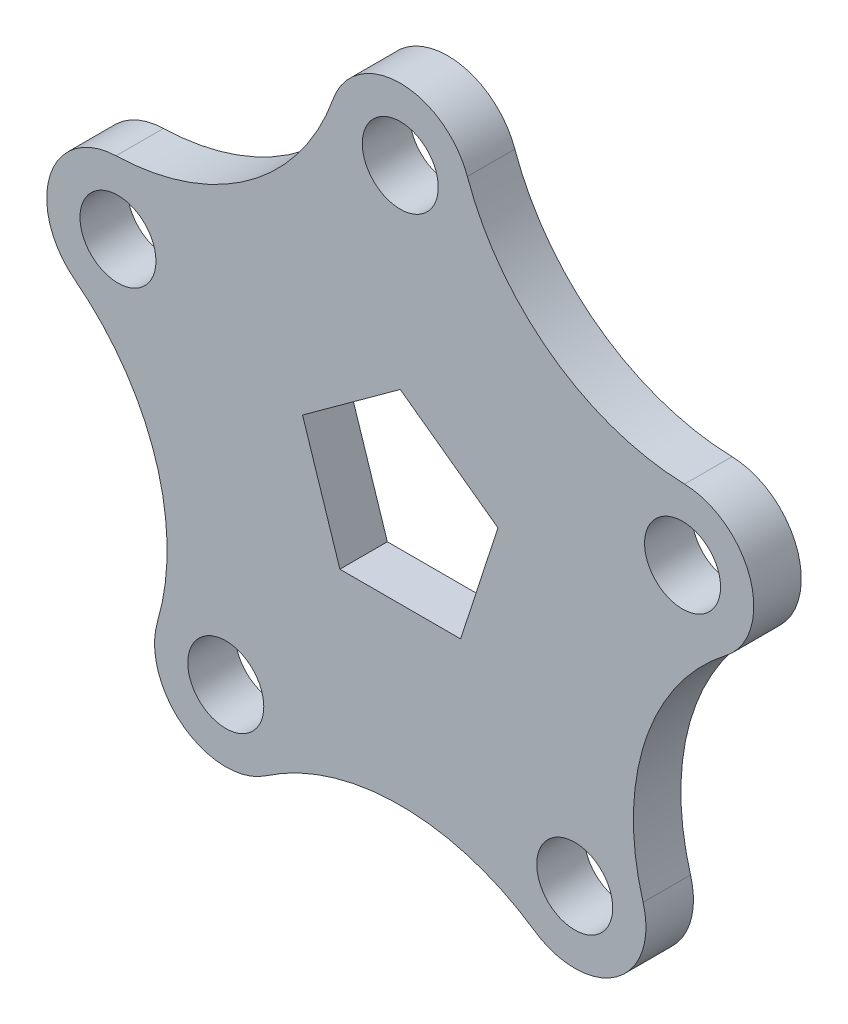
ISO-10303-21;
HEADER;
FILE_DESCRIPTION(('STEP AP214'),'2;1');
FILE_NAME('part.step','',(''),(''),'','','');
FILE_SCHEMA(('AUTOMOTIVE_DESIGN { 1 0 10303 214 1 1 1 1 }'));
ENDSEC;
DATA;
#1=APPLICATION_CONTEXT('core data for automotive mechanical design processes');
#2=APPLICATION_PROTOCOL_DEFINITION('international standard','automotive_design',2000,#1);
#3=PRODUCT_CONTEXT('',#1,'mechanical');
#4=PRODUCT('Part','Part','',(#3));
#5=PRODUCT_RELATED_PRODUCT_CATEGORY('part','',(#4));
#6=PRODUCT_DEFINITION_FORMATION('','',#4);
#7=PRODUCT_DEFINITION_CONTEXT('part definition',#1,'design');
#8=PRODUCT_DEFINITION('design','',#6,#7);
#9=PRODUCT_DEFINITION_SHAPE('','',#8);
#10=(LENGTH_UNIT() NAMED_UNIT(*) SI_UNIT(.MILLI.,.METRE.));
#11=(NAMED_UNIT(*) PLANE_ANGLE_UNIT() SI_UNIT($,.RADIAN.));
#12=(NAMED_UNIT(*) SI_UNIT($,.STERADIAN.) SOLID_ANGLE_UNIT());
#13=UNCERTAINTY_MEASURE_WITH_UNIT(LENGTH_MEASURE(1.E-05),#10,'distance_accuracy_value','');
#14=(GEOMETRIC_REPRESENTATION_CONTEXT(3) GLOBAL_UNCERTAINTY_ASSIGNED_CONTEXT((#13)) GLOBAL_UNIT_ASSIGNED_CONTEXT((#10,
#11,#12)) REPRESENTATION_CONTEXT('',''));
#15=CARTESIAN_POINT('',(0.,0.,0.));
#16=DIRECTION('',(0.,0.,1.));
#17=DIRECTION('',(1.,0.,0.));
#18=AXIS2_PLACEMENT_3D('',#15,#16,#17);
#19=CARTESIAN_POINT('',(60.3401721578418,51.8011220361711,10.));
#20=DIRECTION('',(0.,0.,1.));
#21=DIRECTION('',(1.,0.,0.));
#22=AXIS2_PLACEMENT_3D('',#19,#20,#21);
#23=PLANE('',#22);
#24=CARTESIAN_POINT('',(-36.7365782682793,-50.5635621484338,10.));
#25=DIRECTION('',(0.,0.,1.));
#26=DIRECTION('',(1.,0.,0.));
#27=AXIS2_PLACEMENT_3D('',#24,#25,#26);
#28=CIRCLE('',#27,8.00000000000067);
#29=CARTESIAN_POINT('',(-28.7365782682786,-50.5635621484338,10.));
#30=VERTEX_POINT('',#29);
#31=EDGE_CURVE('E514',#30,#30,#28,.T.);
#32=ORIENTED_EDGE('',*,*,#31,.F.);
#33=EDGE_LOOP('',(#32));
#34=FACE_BOUND('',#33,.T.);
#35=CARTESIAN_POINT('',(59.4410322684476,19.3135621484339,10.));
#36=DIRECTION('',(0.,0.,1.));
#37=DIRECTION('',(1.,0.,0.));
#38=AXIS2_PLACEMENT_3D('',#35,#36,#37);
#39=CIRCLE('',#38,7.99999999999969);
#40=CARTESIAN_POINT('',(67.4410322684473,19.3135621484339,10.));
#41=VERTEX_POINT('',#40);
#42=EDGE_CURVE('E525',#41,#41,#39,.T.);
#43=ORIENTED_EDGE('',*,*,#42,.F.);
#44=EDGE_LOOP('',(#43));
#45=FACE_BOUND('',#44,.T.);
#46=DIRECTION('',(-0.809016994374947,0.587785252292473,0.));
#47=VECTOR('',#46,1.);
#48=CARTESIAN_POINT('',(20.5724838302366,6.68440519687683,10.));
#49=LINE('',#48,#47);
#50=CARTESIAN_POINT('',(20.5724838302366,6.68440519687683,10.));
#51=VERTEX_POINT('',#50);
#52=CARTESIAN_POINT('',(0.,21.6311896062463,10.));
#53=VERTEX_POINT('',#52);
#54=EDGE_CURVE('E153',#51,#53,#49,.T.);
#55=ORIENTED_EDGE('',*,*,#54,.F.);
#56=DIRECTION('',(0.309016994374948,0.951056516295153,0.));
#57=VECTOR('',#56,1.);
#58=CARTESIAN_POINT('',(12.7144942400938,-17.5,10.));
#59=LINE('',#58,#57);
#60=CARTESIAN_POINT('',(12.7144942400938,-17.5,10.));
#61=VERTEX_POINT('',#60);
#62=EDGE_CURVE('E147',#61,#51,#59,.T.);
#63=ORIENTED_EDGE('',*,*,#62,.F.);
#64=DIRECTION('',(1.,0.,0.));
#65=VECTOR('',#64,1.);
#66=CARTESIAN_POINT('',(-12.7144942400938,-17.5,10.));
#67=LINE('',#66,#65);
#68=CARTESIAN_POINT('',(-12.7144942400938,-17.5,10.));
#69=VERTEX_POINT('',#68);
#70=EDGE_CURVE('E172',#69,#61,#67,.T.);
#71=ORIENTED_EDGE('',*,*,#70,.F.);
#72=DIRECTION('',(0.309016994374947,-0.951056516295154,0.));
#73=VECTOR('',#72,1.);
#74=CARTESIAN_POINT('',(-20.5724838302366,6.68440519687686,10.));
#75=LINE('',#74,#73);
#76=CARTESIAN_POINT('',(-20.5724838302366,6.68440519687686,10.));
#77=VERTEX_POINT('',#76);
#78=EDGE_CURVE('E169',#77,#69,#75,.T.);
#79=ORIENTED_EDGE('',*,*,#78,.F.);
#80=DIRECTION('',(-0.809016994374948,-0.587785252292473,0.));
#81=VECTOR('',#80,1.);
#82=CARTESIAN_POINT('',(0.,21.6311896062463,10.));
#83=LINE('',#82,#81);
#84=EDGE_CURVE('E166',#53,#77,#83,.T.);
#85=ORIENTED_EDGE('',*,*,#84,.F.);
#86=EDGE_LOOP('',(#55,#63,#71,#79,#85));
#87=FACE_BOUND('',#86,.T.);
#88=CARTESIAN_POINT('',(61.2393120472361,84.2886819239083,10.));
#89=DIRECTION('',(0.,0.,-1.));
#90=DIRECTION('',(1.,0.,0.));
#91=AXIS2_PLACEMENT_3D('',#88,#89,#90);
#92=CIRCLE('',#91,50.0000000000007);
#93=CARTESIAN_POINT('',(59.856019909707,34.3078205581582,10.));
#94=VERTEX_POINT('',#93);
#95=CARTESIAN_POINT('',(14.1321489339769,67.5281573670544,10.));
#96=VERTEX_POINT('',#95);
#97=EDGE_CURVE('E194',#94,#96,#92,.T.);
#98=ORIENTED_EDGE('',*,*,#97,.T.);
#99=CARTESIAN_POINT('',(0.,62.5,10.));
#100=DIRECTION('',(0.,0.,1.));
#101=DIRECTION('',(1.,0.,0.));
#102=AXIS2_PLACEMENT_3D('',#99,#100,#101);
#103=CIRCLE('',#102,14.9999999999989);
#104=CARTESIAN_POINT('',(-14.1321489339775,67.5281573670528,10.));
#105=VERTEX_POINT('',#104);
#106=EDGE_CURVE('E196',#96,#105,#103,.T.);
#107=ORIENTED_EDGE('',*,*,#106,.T.);
#108=CARTESIAN_POINT('',(-61.2393120472356,84.2886819239057,10.));
#109=DIRECTION('',(0.,0.,-1.));
#110=DIRECTION('',(1.,0.,0.));
#111=AXIS2_PLACEMENT_3D('',#108,#109,#110);
#112=CIRCLE('',#111,50.0000000000004);
#113=CARTESIAN_POINT('',(-59.8560199097055,34.307820558156,10.));
#114=VERTEX_POINT('',#113);
#115=EDGE_CURVE('E198',#105,#114,#112,.T.);
#116=ORIENTED_EDGE('',*,*,#115,.T.);
#117=CARTESIAN_POINT('',(-59.4410322684464,19.3135621484333,10.));
#118=DIRECTION('',(0.,0.,1.));
#119=DIRECTION('',(1.,0.,0.));
#120=AXIS2_PLACEMENT_3D('',#117,#118,#119);
#121=CIRCLE('',#120,14.999999999999);
#122=CARTESIAN_POINT('',(-68.5901682849784,7.42687589233284,10.));
#123=VERTEX_POINT('',#122);
#124=EDGE_CURVE('E202',#114,#123,#121,.T.);
#125=ORIENTED_EDGE('',*,*,#124,.T.);
#126=CARTESIAN_POINT('',(-99.0872883400892,-32.1954116280032,10.));
#127=DIRECTION('',(0.,0.,-1.));
#128=DIRECTION('',(1.,0.,0.));
#129=AXIS2_PLACEMENT_3D('',#126,#127,#128);
#130=CIRCLE('',#129,50.0000000000003);
#131=CARTESIAN_POINT('',(-51.1252036694668,-46.3247581821818,10.));
#132=VERTEX_POINT('',#131);
#133=EDGE_CURVE('E201',#123,#132,#130,.T.);
#134=ORIENTED_EDGE('',*,*,#133,.T.);
#135=CARTESIAN_POINT('',(-36.7365782682793,-50.5635621484338,10.));
#136=DIRECTION('',(0.,0.,1.));
#137=DIRECTION('',(1.,0.,0.));
#138=AXIS2_PLACEMENT_3D('',#135,#136,#137);
#139=CIRCLE('',#138,14.9999999999993);
#140=CARTESIAN_POINT('',(-28.2589063602162,-62.9380956353664,10.));
#141=VERTEX_POINT('',#140);
#142=EDGE_CURVE('E203',#132,#141,#139,.T.);
#143=ORIENTED_EDGE('',*,*,#142,.T.);
#144=CARTESIAN_POINT('',(-6.03683769639929E-13,-104.186540591808,10.));
#145=DIRECTION('',(0.,0.,-1.));
#146=DIRECTION('',(1.,0.,0.));
#147=AXIS2_PLACEMENT_3D('',#144,#145,#146);
#148=CIRCLE('',#147,50.0000000000019);
#149=CARTESIAN_POINT('',(28.2589063602154,-62.9380956353652,10.));
#150=VERTEX_POINT('',#149);
#151=EDGE_CURVE('E207',#141,#150,#148,.T.);
#152=ORIENTED_EDGE('',*,*,#151,.T.);
#153=CARTESIAN_POINT('',(36.7365782682834,-50.5635621484358,10.));
#154=DIRECTION('',(0.,0.,1.));
#155=DIRECTION('',(1.,0.,0.));
#156=AXIS2_PLACEMENT_3D('',#153,#154,#155);
#157=CIRCLE('',#156,14.9999999999972);
#158=CARTESIAN_POINT('',(51.1252036694668,-46.3247581821811,10.));
#159=VERTEX_POINT('',#158);
#160=EDGE_CURVE('E208',#150,#159,#157,.T.);
#161=ORIENTED_EDGE('',*,*,#160,.T.);
#162=CARTESIAN_POINT('',(99.0872883400888,-32.1954116280044,10.));
#163=DIRECTION('',(0.,0.,-1.));
#164=DIRECTION('',(1.,0.,0.));
#165=AXIS2_PLACEMENT_3D('',#162,#163,#164);
#166=CIRCLE('',#165,50.0000000000001);
#167=CARTESIAN_POINT('',(68.5901682849799,7.42687589233302,10.));
#168=VERTEX_POINT('',#167);
#169=EDGE_CURVE('E213',#159,#168,#166,.T.);
#170=ORIENTED_EDGE('',*,*,#169,.T.);
#171=CARTESIAN_POINT('',(59.4410322684476,19.3135621484339,10.));
#172=DIRECTION('',(0.,0.,1.));
#173=DIRECTION('',(1.,0.,0.));
#174=AXIS2_PLACEMENT_3D('',#171,#172,#173);
#175=CIRCLE('',#174,14.9999999999995);
#176=EDGE_CURVE('E211',#168,#94,#175,.T.);
#177=ORIENTED_EDGE('',*,*,#176,.T.);
#178=EDGE_LOOP('',(#98,#107,#116,#125,#134,#143,#152,#161,#170,#177));
#179=FACE_BOUND('',#178,.T.);
#180=CARTESIAN_POINT('',(0.,62.5,10.));
#181=DIRECTION('',(0.,0.,1.));
#182=DIRECTION('',(1.,0.,0.));
#183=AXIS2_PLACEMENT_3D('',#180,#181,#182);
#184=CIRCLE('',#183,8.);
#185=CARTESIAN_POINT('',(8.,62.5,10.));
#186=VERTEX_POINT('',#185);
#187=EDGE_CURVE('E178',#186,#186,#184,.T.);
#188=ORIENTED_EDGE('',*,*,#187,.F.);
#189=EDGE_LOOP('',(#188));
#190=FACE_BOUND('',#189,.T.);
#191=CARTESIAN_POINT('',(36.7365782682834,-50.5635621484358,10.));
#192=DIRECTION('',(0.,0.,1.));
#193=DIRECTION('',(1.,0.,0.));
#194=AXIS2_PLACEMENT_3D('',#191,#192,#193);
#195=CIRCLE('',#194,8.00000000000139);
#196=CARTESIAN_POINT('',(44.7365782682848,-50.5635621484358,10.));
#197=VERTEX_POINT('',#196);
#198=EDGE_CURVE('E519',#197,#197,#195,.T.);
#199=ORIENTED_EDGE('',*,*,#198,.F.);
#200=EDGE_LOOP('',(#199));
#201=FACE_BOUND('',#200,.T.);
#202=CARTESIAN_POINT('',(-59.4410322684464,19.3135621484333,10.));
#203=DIRECTION('',(0.,0.,1.));
#204=DIRECTION('',(1.,0.,0.));
#205=AXIS2_PLACEMENT_3D('',#202,#203,#204);
#206=CIRCLE('',#205,8.0000000000016);
#207=CARTESIAN_POINT('',(-51.4410322684448,19.3135621484333,10.));
#208=VERTEX_POINT('',#207);
#209=EDGE_CURVE('E503',#208,#208,#206,.T.);
#210=ORIENTED_EDGE('',*,*,#209,.F.);
#211=EDGE_LOOP('',(#210));
#212=FACE_BOUND('',#211,.T.);
#213=ADVANCED_FACE('F39',(#34,#45,#87,#179,#190,#201,#212),#23,.T.);
#214=CARTESIAN_POINT('',(60.3401721578418,51.8011220361711,0.));
#215=DIRECTION('',(0.,0.,1.));
#216=DIRECTION('',(1.,0.,0.));
#217=AXIS2_PLACEMENT_3D('',#214,#215,#216);
#218=PLANE('',#217);
#219=CARTESIAN_POINT('',(61.2393120472361,84.2886819239083,0.));
#220=DIRECTION('',(0.,0.,-1.));
#221=DIRECTION('',(1.,0.,0.));
#222=AXIS2_PLACEMENT_3D('',#219,#220,#221);
#223=CIRCLE('',#222,50.0000000000007);
#224=CARTESIAN_POINT('',(59.856019909707,34.3078205581582,0.));
#225=VERTEX_POINT('',#224);
#226=CARTESIAN_POINT('',(14.1321489339769,67.5281573670544,0.));
#227=VERTEX_POINT('',#226);
#228=EDGE_CURVE('E162',#225,#227,#223,.T.);
#229=ORIENTED_EDGE('',*,*,#228,.F.);
#230=CARTESIAN_POINT('',(59.4410322684476,19.3135621484339,0.));
#231=DIRECTION('',(0.,0.,1.));
#232=DIRECTION('',(1.,0.,0.));
#233=AXIS2_PLACEMENT_3D('',#230,#231,#232);
#234=CIRCLE('',#233,14.9999999999995);
#235=CARTESIAN_POINT('',(68.5901682849799,7.42687589233302,0.));
#236=VERTEX_POINT('',#235);
#237=EDGE_CURVE('E197',#236,#225,#234,.T.);
#238=ORIENTED_EDGE('',*,*,#237,.F.);
#239=CARTESIAN_POINT('',(99.0872883400888,-32.1954116280044,0.));
#240=DIRECTION('',(0.,0.,-1.));
#241=DIRECTION('',(1.,0.,0.));
#242=AXIS2_PLACEMENT_3D('',#239,#240,#241);
#243=CIRCLE('',#242,50.0000000000001);
#244=CARTESIAN_POINT('',(51.1252036694668,-46.3247581821811,0.));
#245=VERTEX_POINT('',#244);
#246=EDGE_CURVE('E235',#245,#236,#243,.T.);
#247=ORIENTED_EDGE('',*,*,#246,.F.);
#248=CARTESIAN_POINT('',(36.7365782682834,-50.5635621484358,0.));
#249=DIRECTION('',(0.,0.,1.));
#250=DIRECTION('',(1.,0.,0.));
#251=AXIS2_PLACEMENT_3D('',#248,#249,#250);
#252=CIRCLE('',#251,14.9999999999972);
#253=CARTESIAN_POINT('',(28.2589063602154,-62.9380956353652,0.));
#254=VERTEX_POINT('',#253);
#255=EDGE_CURVE('E229',#254,#245,#252,.T.);
#256=ORIENTED_EDGE('',*,*,#255,.F.);
#257=CARTESIAN_POINT('',(-6.03683769639929E-13,-104.186540591808,0.));
#258=DIRECTION('',(0.,0.,-1.));
#259=DIRECTION('',(1.,0.,0.));
#260=AXIS2_PLACEMENT_3D('',#257,#258,#259);
#261=CIRCLE('',#260,50.0000000000019);
#262=CARTESIAN_POINT('',(-28.2589063602162,-62.9380956353664,0.));
#263=VERTEX_POINT('',#262);
#264=EDGE_CURVE('E228',#263,#254,#261,.T.);
#265=ORIENTED_EDGE('',*,*,#264,.F.);
#266=CARTESIAN_POINT('',(-36.7365782682793,-50.5635621484338,0.));
#267=DIRECTION('',(0.,0.,1.));
#268=DIRECTION('',(1.,0.,0.));
#269=AXIS2_PLACEMENT_3D('',#266,#267,#268);
#270=CIRCLE('',#269,14.9999999999993);
#271=CARTESIAN_POINT('',(-51.1252036694668,-46.3247581821818,0.));
#272=VERTEX_POINT('',#271);
#273=EDGE_CURVE('E226',#272,#263,#270,.T.);
#274=ORIENTED_EDGE('',*,*,#273,.F.);
#275=CARTESIAN_POINT('',(-99.0872883400892,-32.1954116280032,0.));
#276=DIRECTION('',(0.,0.,-1.));
#277=DIRECTION('',(1.,0.,0.));
#278=AXIS2_PLACEMENT_3D('',#275,#276,#277);
#279=CIRCLE('',#278,50.0000000000003);
#280=CARTESIAN_POINT('',(-68.5901682849784,7.42687589233284,0.));
#281=VERTEX_POINT('',#280);
#282=EDGE_CURVE('E222',#281,#272,#279,.T.);
#283=ORIENTED_EDGE('',*,*,#282,.F.);
#284=CARTESIAN_POINT('',(-59.4410322684464,19.3135621484333,0.));
#285=DIRECTION('',(0.,0.,1.));
#286=DIRECTION('',(1.,0.,0.));
#287=AXIS2_PLACEMENT_3D('',#284,#285,#286);
#288=CIRCLE('',#287,14.999999999999);
#289=CARTESIAN_POINT('',(-59.8560199097055,34.307820558156,0.));
#290=VERTEX_POINT('',#289);
#291=EDGE_CURVE('E225',#290,#281,#288,.T.);
#292=ORIENTED_EDGE('',*,*,#291,.F.);
#293=CARTESIAN_POINT('',(-61.2393120472356,84.2886819239057,0.));
#294=DIRECTION('',(0.,0.,-1.));
#295=DIRECTION('',(1.,0.,0.));
#296=AXIS2_PLACEMENT_3D('',#293,#294,#295);
#297=CIRCLE('',#296,50.0000000000004);
#298=CARTESIAN_POINT('',(-14.1321489339775,67.5281573670528,0.));
#299=VERTEX_POINT('',#298);
#300=EDGE_CURVE('E217',#299,#290,#297,.T.);
#301=ORIENTED_EDGE('',*,*,#300,.F.);
#302=CARTESIAN_POINT('',(0.,62.5,0.));
#303=DIRECTION('',(0.,0.,1.));
#304=DIRECTION('',(1.,0.,0.));
#305=AXIS2_PLACEMENT_3D('',#302,#303,#304);
#306=CIRCLE('',#305,14.9999999999989);
#307=EDGE_CURVE('E216',#227,#299,#306,.T.);
#308=ORIENTED_EDGE('',*,*,#307,.F.);
#309=EDGE_LOOP('',(#229,#238,#247,#256,#265,#274,#283,#292,#301,#308));
#310=FACE_BOUND('',#309,.T.);
#311=DIRECTION('',(0.309016994374948,0.951056516295153,0.));
#312=VECTOR('',#311,1.);
#313=CARTESIAN_POINT('',(12.7144942400938,-17.5,0.));
#314=LINE('',#313,#312);
#315=CARTESIAN_POINT('',(12.7144942400938,-17.5,0.));
#316=VERTEX_POINT('',#315);
#317=CARTESIAN_POINT('',(20.5724838302366,6.68440519687683,0.));
#318=VERTEX_POINT('',#317);
#319=EDGE_CURVE('E62',#316,#318,#314,.T.);
#320=ORIENTED_EDGE('',*,*,#319,.T.);
#321=DIRECTION('',(-0.809016994374947,0.587785252292473,0.));
#322=VECTOR('',#321,1.);
#323=CARTESIAN_POINT('',(20.5724838302366,6.68440519687683,0.));
#324=LINE('',#323,#322);
#325=CARTESIAN_POINT('',(0.,21.6311896062463,0.));
#326=VERTEX_POINT('',#325);
#327=EDGE_CURVE('E161',#318,#326,#324,.T.);
#328=ORIENTED_EDGE('',*,*,#327,.T.);
#329=DIRECTION('',(-0.809016994374948,-0.587785252292473,0.));
#330=VECTOR('',#329,1.);
#331=CARTESIAN_POINT('',(0.,21.6311896062463,0.));
#332=LINE('',#331,#330);
#333=CARTESIAN_POINT('',(-20.5724838302366,6.68440519687686,0.));
#334=VERTEX_POINT('',#333);
#335=EDGE_CURVE('E179',#326,#334,#332,.T.);
#336=ORIENTED_EDGE('',*,*,#335,.T.);
#337=DIRECTION('',(0.309016994374947,-0.951056516295154,0.));
#338=VECTOR('',#337,1.);
#339=CARTESIAN_POINT('',(-20.5724838302366,6.68440519687686,0.));
#340=LINE('',#339,#338);
#341=CARTESIAN_POINT('',(-12.7144942400938,-17.5,0.));
#342=VERTEX_POINT('',#341);
#343=EDGE_CURVE('E183',#334,#342,#340,.T.);
#344=ORIENTED_EDGE('',*,*,#343,.T.);
#345=DIRECTION('',(1.,0.,0.));
#346=VECTOR('',#345,1.);
#347=CARTESIAN_POINT('',(-12.7144942400938,-17.5,0.));
#348=LINE('',#347,#346);
#349=EDGE_CURVE('E155',#342,#316,#348,.T.);
#350=ORIENTED_EDGE('',*,*,#349,.T.);
#351=EDGE_LOOP('',(#320,#328,#336,#344,#350));
#352=FACE_BOUND('',#351,.T.);
#353=CARTESIAN_POINT('',(0.,62.5,0.));
#354=DIRECTION('',(0.,0.,1.));
#355=DIRECTION('',(1.,0.,0.));
#356=AXIS2_PLACEMENT_3D('',#353,#354,#355);
#357=CIRCLE('',#356,8.);
#358=CARTESIAN_POINT('',(8.,62.5,0.));
#359=VERTEX_POINT('',#358);
#360=EDGE_CURVE('E526',#359,#359,#357,.T.);
#361=ORIENTED_EDGE('',*,*,#360,.T.);
#362=EDGE_LOOP('',(#361));
#363=FACE_BOUND('',#362,.T.);
#364=CARTESIAN_POINT('',(59.4410322684476,19.3135621484339,0.));
#365=DIRECTION('',(0.,0.,1.));
#366=DIRECTION('',(1.,0.,0.));
#367=AXIS2_PLACEMENT_3D('',#364,#365,#366);
#368=CIRCLE('',#367,7.99999999999969);
#369=CARTESIAN_POINT('',(67.4410322684473,19.3135621484339,0.));
#370=VERTEX_POINT('',#369);
#371=EDGE_CURVE('E522',#370,#370,#368,.T.);
#372=ORIENTED_EDGE('',*,*,#371,.T.);
#373=EDGE_LOOP('',(#372));
#374=FACE_BOUND('',#373,.T.);
#375=CARTESIAN_POINT('',(36.7365782682834,-50.5635621484358,0.));
#376=DIRECTION('',(0.,0.,1.));
#377=DIRECTION('',(1.,0.,0.));
#378=AXIS2_PLACEMENT_3D('',#375,#376,#377);
#379=CIRCLE('',#378,8.00000000000139);
#380=CARTESIAN_POINT('',(44.7365782682848,-50.5635621484358,0.));
#381=VERTEX_POINT('',#380);
#382=EDGE_CURVE('E517',#381,#381,#379,.T.);
#383=ORIENTED_EDGE('',*,*,#382,.T.);
#384=EDGE_LOOP('',(#383));
#385=FACE_BOUND('',#384,.T.);
#386=CARTESIAN_POINT('',(-36.7365782682793,-50.5635621484338,0.));
#387=DIRECTION('',(0.,0.,1.));
#388=DIRECTION('',(1.,0.,0.));
#389=AXIS2_PLACEMENT_3D('',#386,#387,#388);
#390=CIRCLE('',#389,8.00000000000067);
#391=CARTESIAN_POINT('',(-28.7365782682786,-50.5635621484338,0.));
#392=VERTEX_POINT('',#391);
#393=EDGE_CURVE('E508',#392,#392,#390,.T.);
#394=ORIENTED_EDGE('',*,*,#393,.T.);
#395=EDGE_LOOP('',(#394));
#396=FACE_BOUND('',#395,.T.);
#397=CARTESIAN_POINT('',(-59.4410322684464,19.3135621484333,0.));
#398=DIRECTION('',(0.,0.,1.));
#399=DIRECTION('',(1.,0.,0.));
#400=AXIS2_PLACEMENT_3D('',#397,#398,#399);
#401=CIRCLE('',#400,8.0000000000016);
#402=CARTESIAN_POINT('',(-51.4410322684448,19.3135621484333,0.));
#403=VERTEX_POINT('',#402);
#404=EDGE_CURVE('E510',#403,#403,#401,.T.);
#405=ORIENTED_EDGE('',*,*,#404,.T.);
#406=EDGE_LOOP('',(#405));
#407=FACE_BOUND('',#406,.T.);
#408=ADVANCED_FACE('F268',(#310,#352,#363,#374,#385,#396,#407),#218,.F.);
#409=CARTESIAN_POINT('',(61.2393120472361,84.2886819239083,10.));
#410=DIRECTION('',(0.,0.,-1.));
#411=DIRECTION('',(-1.,0.,0.));
#412=AXIS2_PLACEMENT_3D('',#409,#410,#411);
#413=CYLINDRICAL_SURFACE('',#412,50.0000000000007);
#414=ORIENTED_EDGE('',*,*,#228,.T.);
#415=DIRECTION('',(0.,0.,-1.));
#416=VECTOR('',#415,1.);
#417=CARTESIAN_POINT('',(14.1321489339769,67.5281573670544,10.));
#418=LINE('',#417,#416);
#419=EDGE_CURVE('E11',#96,#227,#418,.T.);
#420=ORIENTED_EDGE('',*,*,#419,.F.);
#421=ORIENTED_EDGE('',*,*,#97,.F.);
#422=DIRECTION('',(0.,0.,-1.));
#423=VECTOR('',#422,1.);
#424=CARTESIAN_POINT('',(59.856019909707,34.3078205581582,10.));
#425=LINE('',#424,#423);
#426=EDGE_CURVE('E214',#94,#225,#425,.T.);
#427=ORIENTED_EDGE('',*,*,#426,.T.);
#428=EDGE_LOOP('',(#414,#420,#421,#427));
#429=FACE_BOUND('',#428,.T.);
#430=ADVANCED_FACE('F41',(#429),#413,.F.);
#431=CARTESIAN_POINT('',(0.,62.5,10.));
#432=DIRECTION('',(0.,0.,-1.));
#433=DIRECTION('',(-1.,0.,0.));
#434=AXIS2_PLACEMENT_3D('',#431,#432,#433);
#435=CYLINDRICAL_SURFACE('',#434,14.9999999999989);
#436=ORIENTED_EDGE('',*,*,#307,.T.);
#437=DIRECTION('',(0.,0.,-1.));
#438=VECTOR('',#437,1.);
#439=CARTESIAN_POINT('',(-14.1321489339775,67.5281573670528,10.));
#440=LINE('',#439,#438);
#441=EDGE_CURVE('E50',#105,#299,#440,.T.);
#442=ORIENTED_EDGE('',*,*,#441,.F.);
#443=ORIENTED_EDGE('',*,*,#106,.F.);
#444=ORIENTED_EDGE('',*,*,#419,.T.);
#445=EDGE_LOOP('',(#436,#442,#443,#444));
#446=FACE_BOUND('',#445,.T.);
#447=ADVANCED_FACE('F283',(#446),#435,.T.);
#448=CARTESIAN_POINT('',(-61.2393120472356,84.2886819239057,10.));
#449=DIRECTION('',(0.,0.,-1.));
#450=DIRECTION('',(-1.,0.,0.));
#451=AXIS2_PLACEMENT_3D('',#448,#449,#450);
#452=CYLINDRICAL_SURFACE('',#451,50.0000000000004);
#453=ORIENTED_EDGE('',*,*,#300,.T.);
#454=DIRECTION('',(0.,0.,-1.));
#455=VECTOR('',#454,1.);
#456=CARTESIAN_POINT('',(-59.8560199097055,34.307820558156,10.));
#457=LINE('',#456,#455);
#458=EDGE_CURVE('E255',#114,#290,#457,.T.);
#459=ORIENTED_EDGE('',*,*,#458,.F.);
#460=ORIENTED_EDGE('',*,*,#115,.F.);
#461=ORIENTED_EDGE('',*,*,#441,.T.);
#462=EDGE_LOOP('',(#453,#459,#460,#461));
#463=FACE_BOUND('',#462,.T.);
#464=ADVANCED_FACE('F265',(#463),#452,.F.);
#465=CARTESIAN_POINT('',(-59.4410322684464,19.3135621484333,10.));
#466=DIRECTION('',(0.,0.,-1.));
#467=DIRECTION('',(-1.,0.,0.));
#468=AXIS2_PLACEMENT_3D('',#465,#466,#467);
#469=CYLINDRICAL_SURFACE('',#468,14.999999999999);
#470=ORIENTED_EDGE('',*,*,#291,.T.);
#471=DIRECTION('',(0.,0.,-1.));
#472=VECTOR('',#471,1.);
#473=CARTESIAN_POINT('',(-68.5901682849784,7.42687589233284,10.));
#474=LINE('',#473,#472);
#475=EDGE_CURVE('E252',#123,#281,#474,.T.);
#476=ORIENTED_EDGE('',*,*,#475,.F.);
#477=ORIENTED_EDGE('',*,*,#124,.F.);
#478=ORIENTED_EDGE('',*,*,#458,.T.);
#479=EDGE_LOOP('',(#470,#476,#477,#478));
#480=FACE_BOUND('',#479,.T.);
#481=ADVANCED_FACE('F272',(#480),#469,.T.);
#482=CARTESIAN_POINT('',(-99.0872883400892,-32.1954116280032,10.));
#483=DIRECTION('',(0.,0.,-1.));
#484=DIRECTION('',(-1.,0.,0.));
#485=AXIS2_PLACEMENT_3D('',#482,#483,#484);
#486=CYLINDRICAL_SURFACE('',#485,50.0000000000003);
#487=ORIENTED_EDGE('',*,*,#282,.T.);
#488=DIRECTION('',(0.,0.,-1.));
#489=VECTOR('',#488,1.);
#490=CARTESIAN_POINT('',(-51.1252036694668,-46.3247581821818,10.));
#491=LINE('',#490,#489);
#492=EDGE_CURVE('E249',#132,#272,#491,.T.);
#493=ORIENTED_EDGE('',*,*,#492,.F.);
#494=ORIENTED_EDGE('',*,*,#133,.F.);
#495=ORIENTED_EDGE('',*,*,#475,.T.);
#496=EDGE_LOOP('',(#487,#493,#494,#495));
#497=FACE_BOUND('',#496,.T.);
#498=ADVANCED_FACE('F277',(#497),#486,.F.);
#499=CARTESIAN_POINT('',(-36.7365782682793,-50.5635621484338,10.));
#500=DIRECTION('',(0.,0.,-1.));
#501=DIRECTION('',(-1.,0.,0.));
#502=AXIS2_PLACEMENT_3D('',#499,#500,#501);
#503=CYLINDRICAL_SURFACE('',#502,14.9999999999993);
#504=ORIENTED_EDGE('',*,*,#273,.T.);
#505=DIRECTION('',(0.,0.,-1.));
#506=VECTOR('',#505,1.);
#507=CARTESIAN_POINT('',(-28.2589063602162,-62.9380956353664,10.));
#508=LINE('',#507,#506);
#509=EDGE_CURVE('E247',#141,#263,#508,.T.);
#510=ORIENTED_EDGE('',*,*,#509,.F.);
#511=ORIENTED_EDGE('',*,*,#142,.F.);
#512=ORIENTED_EDGE('',*,*,#492,.T.);
#513=EDGE_LOOP('',(#504,#510,#511,#512));
#514=FACE_BOUND('',#513,.T.);
#515=ADVANCED_FACE('F306',(#514),#503,.T.);
#516=CARTESIAN_POINT('',(-6.03683769639929E-13,-104.186540591808,10.));
#517=DIRECTION('',(0.,0.,-1.));
#518=DIRECTION('',(-1.,0.,0.));
#519=AXIS2_PLACEMENT_3D('',#516,#517,#518);
#520=CYLINDRICAL_SURFACE('',#519,50.0000000000019);
#521=ORIENTED_EDGE('',*,*,#264,.T.);
#522=DIRECTION('',(0.,0.,-1.));
#523=VECTOR('',#522,1.);
#524=CARTESIAN_POINT('',(28.2589063602154,-62.9380956353652,10.));
#525=LINE('',#524,#523);
#526=EDGE_CURVE('E244',#150,#254,#525,.T.);
#527=ORIENTED_EDGE('',*,*,#526,.F.);
#528=ORIENTED_EDGE('',*,*,#151,.F.);
#529=ORIENTED_EDGE('',*,*,#509,.T.);
#530=EDGE_LOOP('',(#521,#527,#528,#529));
#531=FACE_BOUND('',#530,.T.);
#532=ADVANCED_FACE('F304',(#531),#520,.F.);
#533=CARTESIAN_POINT('',(36.7365782682834,-50.5635621484358,10.));
#534=DIRECTION('',(0.,0.,-1.));
#535=DIRECTION('',(-1.,0.,0.));
#536=AXIS2_PLACEMENT_3D('',#533,#534,#535);
#537=CYLINDRICAL_SURFACE('',#536,14.9999999999972);
#538=ORIENTED_EDGE('',*,*,#255,.T.);
#539=DIRECTION('',(0.,0.,-1.));
#540=VECTOR('',#539,1.);
#541=CARTESIAN_POINT('',(51.1252036694668,-46.3247581821811,10.));
#542=LINE('',#541,#540);
#543=EDGE_CURVE('E238',#159,#245,#542,.T.);
#544=ORIENTED_EDGE('',*,*,#543,.F.);
#545=ORIENTED_EDGE('',*,*,#160,.F.);
#546=ORIENTED_EDGE('',*,*,#526,.T.);
#547=EDGE_LOOP('',(#538,#544,#545,#546));
#548=FACE_BOUND('',#547,.T.);
#549=ADVANCED_FACE('F303',(#548),#537,.T.);
#550=CARTESIAN_POINT('',(99.0872883400888,-32.1954116280044,10.));
#551=DIRECTION('',(0.,0.,-1.));
#552=DIRECTION('',(-1.,0.,0.));
#553=AXIS2_PLACEMENT_3D('',#550,#551,#552);
#554=CYLINDRICAL_SURFACE('',#553,50.0000000000001);
#555=ORIENTED_EDGE('',*,*,#246,.T.);
#556=DIRECTION('',(0.,0.,-1.));
#557=VECTOR('',#556,1.);
#558=CARTESIAN_POINT('',(68.5901682849799,7.42687589233302,10.));
#559=LINE('',#558,#557);
#560=EDGE_CURVE('E240',#168,#236,#559,.T.);
#561=ORIENTED_EDGE('',*,*,#560,.F.);
#562=ORIENTED_EDGE('',*,*,#169,.F.);
#563=ORIENTED_EDGE('',*,*,#543,.T.);
#564=EDGE_LOOP('',(#555,#561,#562,#563));
#565=FACE_BOUND('',#564,.T.);
#566=ADVANCED_FACE('F297',(#565),#554,.F.);
#567=CARTESIAN_POINT('',(59.4410322684476,19.3135621484339,10.));
#568=DIRECTION('',(0.,0.,-1.));
#569=DIRECTION('',(-1.,0.,0.));
#570=AXIS2_PLACEMENT_3D('',#567,#568,#569);
#571=CYLINDRICAL_SURFACE('',#570,14.9999999999995);
#572=ORIENTED_EDGE('',*,*,#237,.T.);
#573=ORIENTED_EDGE('',*,*,#426,.F.);
#574=ORIENTED_EDGE('',*,*,#176,.F.);
#575=ORIENTED_EDGE('',*,*,#560,.T.);
#576=EDGE_LOOP('',(#572,#573,#574,#575));
#577=FACE_BOUND('',#576,.T.);
#578=ADVANCED_FACE('F295',(#577),#571,.T.);
#579=CARTESIAN_POINT('',(12.7144942400938,-17.5,10.));
#580=DIRECTION('',(-0.951056516295153,0.309016994374948,0.));
#581=DIRECTION('',(-0.309016994374948,-0.951056516295153,0.));
#582=AXIS2_PLACEMENT_3D('',#579,#580,#581);
#583=PLANE('',#582);
#584=ORIENTED_EDGE('',*,*,#319,.F.);
#585=DIRECTION('',(0.,0.,-1.));
#586=VECTOR('',#585,1.);
#587=CARTESIAN_POINT('',(12.7144942400938,-17.5,10.));
#588=LINE('',#587,#586);
#589=EDGE_CURVE('E148',#61,#316,#588,.T.);
#590=ORIENTED_EDGE('',*,*,#589,.F.);
#591=ORIENTED_EDGE('',*,*,#62,.T.);
#592=DIRECTION('',(0.,0.,-1.));
#593=VECTOR('',#592,1.);
#594=CARTESIAN_POINT('',(20.5724838302366,6.68440519687683,10.));
#595=LINE('',#594,#593);
#596=EDGE_CURVE('E146',#51,#318,#595,.T.);
#597=ORIENTED_EDGE('',*,*,#596,.T.);
#598=EDGE_LOOP('',(#584,#590,#591,#597));
#599=FACE_BOUND('',#598,.T.);
#600=ADVANCED_FACE('F149',(#599),#583,.T.);
#601=CARTESIAN_POINT('',(20.5724838302366,6.68440519687683,10.));
#602=DIRECTION('',(-0.587785252292473,-0.809016994374947,0.));
#603=DIRECTION('',(0.809016994374947,-0.587785252292473,0.));
#604=AXIS2_PLACEMENT_3D('',#601,#602,#603);
#605=PLANE('',#604);
#606=ORIENTED_EDGE('',*,*,#327,.F.);
#607=ORIENTED_EDGE('',*,*,#596,.F.);
#608=ORIENTED_EDGE('',*,*,#54,.T.);
#609=DIRECTION('',(0.,0.,-1.));
#610=VECTOR('',#609,1.);
#611=CARTESIAN_POINT('',(0.,21.6311896062463,10.));
#612=LINE('',#611,#610);
#613=EDGE_CURVE('E164',#53,#326,#612,.T.);
#614=ORIENTED_EDGE('',*,*,#613,.T.);
#615=EDGE_LOOP('',(#606,#607,#608,#614));
#616=FACE_BOUND('',#615,.T.);
#617=ADVANCED_FACE('F156',(#616),#605,.T.);
#618=CARTESIAN_POINT('',(0.,21.6311896062463,10.));
#619=DIRECTION('',(0.587785252292473,-0.809016994374948,0.));
#620=DIRECTION('',(0.809016994374948,0.587785252292473,0.));
#621=AXIS2_PLACEMENT_3D('',#618,#619,#620);
#622=PLANE('',#621);
#623=ORIENTED_EDGE('',*,*,#335,.F.);
#624=ORIENTED_EDGE('',*,*,#613,.F.);
#625=ORIENTED_EDGE('',*,*,#84,.T.);
#626=DIRECTION('',(0.,0.,-1.));
#627=VECTOR('',#626,1.);
#628=CARTESIAN_POINT('',(-20.5724838302366,6.68440519687686,10.));
#629=LINE('',#628,#627);
#630=EDGE_CURVE('E189',#77,#334,#629,.T.);
#631=ORIENTED_EDGE('',*,*,#630,.T.);
#632=EDGE_LOOP('',(#623,#624,#625,#631));
#633=FACE_BOUND('',#632,.T.);
#634=ADVANCED_FACE('F361',(#633),#622,.T.);
#635=CARTESIAN_POINT('',(-20.5724838302366,6.68440519687686,10.));
#636=DIRECTION('',(0.951056516295154,0.309016994374947,0.));
#637=DIRECTION('',(-0.309016994374947,0.951056516295154,0.));
#638=AXIS2_PLACEMENT_3D('',#635,#636,#637);
#639=PLANE('',#638);
#640=ORIENTED_EDGE('',*,*,#343,.F.);
#641=ORIENTED_EDGE('',*,*,#630,.F.);
#642=ORIENTED_EDGE('',*,*,#78,.T.);
#643=DIRECTION('',(0.,0.,-1.));
#644=VECTOR('',#643,1.);
#645=CARTESIAN_POINT('',(-12.7144942400938,-17.5,10.));
#646=LINE('',#645,#644);
#647=EDGE_CURVE('E53',#69,#342,#646,.T.);
#648=ORIENTED_EDGE('',*,*,#647,.T.);
#649=EDGE_LOOP('',(#640,#641,#642,#648));
#650=FACE_BOUND('',#649,.T.);
#651=ADVANCED_FACE('F367',(#650),#639,.T.);
#652=CARTESIAN_POINT('',(-12.7144942400938,-17.5,10.));
#653=DIRECTION('',(0.,1.,0.));
#654=DIRECTION('',(-1.,0.,0.));
#655=AXIS2_PLACEMENT_3D('',#652,#653,#654);
#656=PLANE('',#655);
#657=ORIENTED_EDGE('',*,*,#349,.F.);
#658=ORIENTED_EDGE('',*,*,#647,.F.);
#659=ORIENTED_EDGE('',*,*,#70,.T.);
#660=ORIENTED_EDGE('',*,*,#589,.T.);
#661=EDGE_LOOP('',(#657,#658,#659,#660));
#662=FACE_BOUND('',#661,.T.);
#663=ADVANCED_FACE('F377',(#662),#656,.T.);
#664=CARTESIAN_POINT('',(0.,62.5,10.));
#665=DIRECTION('',(0.,0.,-1.));
#666=DIRECTION('',(-1.,0.,0.));
#667=AXIS2_PLACEMENT_3D('',#664,#665,#666);
#668=CYLINDRICAL_SURFACE('',#667,8.);
#669=ORIENTED_EDGE('',*,*,#187,.T.);
#670=EDGE_LOOP('',(#669));
#671=FACE_BOUND('',#670,.T.);
#672=ORIENTED_EDGE('',*,*,#360,.F.);
#673=EDGE_LOOP('',(#672));
#674=FACE_BOUND('',#673,.T.);
#675=ADVANCED_FACE('F386',(#671,#674),#668,.F.);
#676=CARTESIAN_POINT('',(59.4410322684476,19.3135621484339,10.));
#677=DIRECTION('',(0.,0.,-1.));
#678=DIRECTION('',(-1.,0.,0.));
#679=AXIS2_PLACEMENT_3D('',#676,#677,#678);
#680=CYLINDRICAL_SURFACE('',#679,7.99999999999969);
#681=ORIENTED_EDGE('',*,*,#42,.T.);
#682=EDGE_LOOP('',(#681));
#683=FACE_BOUND('',#682,.T.);
#684=ORIENTED_EDGE('',*,*,#371,.F.);
#685=EDGE_LOOP('',(#684));
#686=FACE_BOUND('',#685,.T.);
#687=ADVANCED_FACE('F395',(#683,#686),#680,.F.);
#688=CARTESIAN_POINT('',(36.7365782682834,-50.5635621484358,10.));
#689=DIRECTION('',(0.,0.,-1.));
#690=DIRECTION('',(-1.,0.,0.));
#691=AXIS2_PLACEMENT_3D('',#688,#689,#690);
#692=CYLINDRICAL_SURFACE('',#691,8.00000000000139);
#693=ORIENTED_EDGE('',*,*,#198,.T.);
#694=EDGE_LOOP('',(#693));
#695=FACE_BOUND('',#694,.T.);
#696=ORIENTED_EDGE('',*,*,#382,.F.);
#697=EDGE_LOOP('',(#696));
#698=FACE_BOUND('',#697,.T.);
#699=ADVANCED_FACE('F403',(#695,#698),#692,.F.);
#700=CARTESIAN_POINT('',(-36.7365782682793,-50.5635621484338,10.));
#701=DIRECTION('',(0.,0.,-1.));
#702=DIRECTION('',(-1.,0.,0.));
#703=AXIS2_PLACEMENT_3D('',#700,#701,#702);
#704=CYLINDRICAL_SURFACE('',#703,8.00000000000067);
#705=ORIENTED_EDGE('',*,*,#31,.T.);
#706=EDGE_LOOP('',(#705));
#707=FACE_BOUND('',#706,.T.);
#708=ORIENTED_EDGE('',*,*,#393,.F.);
#709=EDGE_LOOP('',(#708));
#710=FACE_BOUND('',#709,.T.);
#711=ADVANCED_FACE('F415',(#707,#710),#704,.F.);
#712=CARTESIAN_POINT('',(-59.4410322684464,19.3135621484333,10.));
#713=DIRECTION('',(0.,0.,-1.));
#714=DIRECTION('',(-1.,0.,0.));
#715=AXIS2_PLACEMENT_3D('',#712,#713,#714);
#716=CYLINDRICAL_SURFACE('',#715,8.0000000000016);
#717=ORIENTED_EDGE('',*,*,#209,.T.);
#718=EDGE_LOOP('',(#717));
#719=FACE_BOUND('',#718,.T.);
#720=ORIENTED_EDGE('',*,*,#404,.F.);
#721=EDGE_LOOP('',(#720));
#722=FACE_BOUND('',#721,.T.);
#723=ADVANCED_FACE('F421',(#719,#722),#716,.F.);
#724=CLOSED_SHELL('',(#213,#408,#430,#447,#464,#481,#498,#515,#532,#549,#566,#578,#600,#617,
#634,#651,#663,#675,#687,#699,#711,#723));
#725=MANIFOLD_SOLID_BREP('B2',#724);
#726=ADVANCED_BREP_SHAPE_REPRESENTATION('',(#18,#725),#14);
#727=SHAPE_DEFINITION_REPRESENTATION(#9,#726);
ENDSEC;
END-ISO-10303-21;
